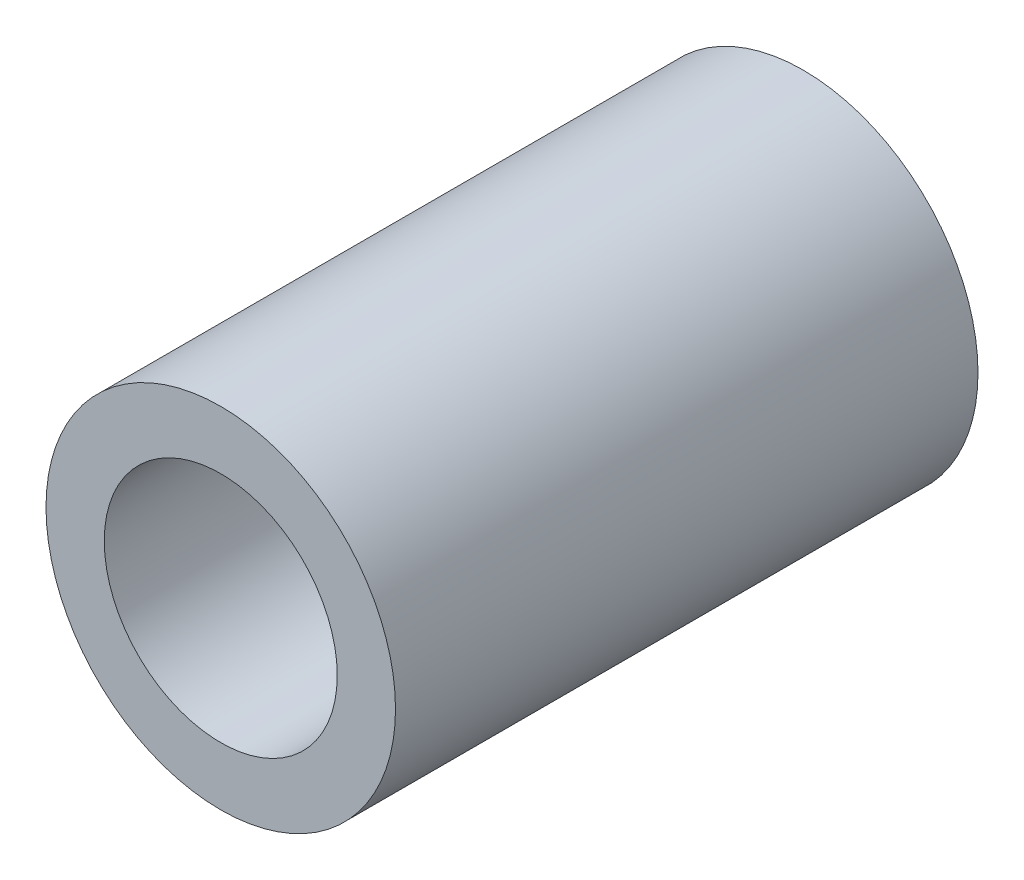
ISO-10303-21;
HEADER;
FILE_DESCRIPTION(('STEP AP214'),'2;1');
FILE_NAME('part.step','',(''),(''),'','','');
FILE_SCHEMA(('AUTOMOTIVE_DESIGN { 1 0 10303 214 1 1 1 1 }'));
ENDSEC;
DATA;
#1=APPLICATION_CONTEXT('core data for automotive mechanical design processes');
#2=APPLICATION_PROTOCOL_DEFINITION('international standard','automotive_design',2000,#1);
#3=PRODUCT_CONTEXT('',#1,'mechanical');
#4=PRODUCT('Part','Part','',(#3));
#5=PRODUCT_RELATED_PRODUCT_CATEGORY('part','',(#4));
#6=PRODUCT_DEFINITION_FORMATION('','',#4);
#7=PRODUCT_DEFINITION_CONTEXT('part definition',#1,'design');
#8=PRODUCT_DEFINITION('design','',#6,#7);
#9=PRODUCT_DEFINITION_SHAPE('','',#8);
#10=(LENGTH_UNIT() NAMED_UNIT(*) SI_UNIT(.MILLI.,.METRE.));
#11=(NAMED_UNIT(*) PLANE_ANGLE_UNIT() SI_UNIT($,.RADIAN.));
#12=(NAMED_UNIT(*) SI_UNIT($,.STERADIAN.) SOLID_ANGLE_UNIT());
#13=UNCERTAINTY_MEASURE_WITH_UNIT(LENGTH_MEASURE(1.E-05),#10,'distance_accuracy_value','');
#14=(GEOMETRIC_REPRESENTATION_CONTEXT(3) GLOBAL_UNCERTAINTY_ASSIGNED_CONTEXT((#13)) GLOBAL_UNIT_ASSIGNED_CONTEXT((#10,
#11,#12)) REPRESENTATION_CONTEXT('',''));
#15=CARTESIAN_POINT('',(0.,0.,0.));
#16=DIRECTION('',(0.,0.,1.));
#17=DIRECTION('',(1.,0.,0.));
#18=AXIS2_PLACEMENT_3D('',#15,#16,#17);
#19=CARTESIAN_POINT('',(0.,0.,100.));
#20=DIRECTION('',(0.,0.,1.));
#21=DIRECTION('',(1.,0.,0.));
#22=AXIS2_PLACEMENT_3D('',#19,#20,#21);
#23=PLANE('',#22);
#24=CARTESIAN_POINT('',(0.,0.,100.));
#25=DIRECTION('',(0.,0.,1.));
#26=DIRECTION('',(1.,0.,0.));
#27=AXIS2_PLACEMENT_3D('',#24,#25,#26);
#28=CIRCLE('',#27,30.);
#29=CARTESIAN_POINT('',(-30.,0.,100.));
#30=VERTEX_POINT('',#29);
#31=EDGE_CURVE('E10',#30,#30,#28,.T.);
#32=ORIENTED_EDGE('',*,*,#31,.T.);
#33=EDGE_LOOP('',(#32));
#34=FACE_BOUND('',#33,.T.);
#35=CARTESIAN_POINT('',(0.,0.,100.));
#36=DIRECTION('',(0.,0.,1.));
#37=DIRECTION('',(1.,0.,0.));
#38=AXIS2_PLACEMENT_3D('',#35,#36,#37);
#39=CIRCLE('',#38,20.);
#40=CARTESIAN_POINT('',(-20.,0.,100.));
#41=VERTEX_POINT('',#40);
#42=EDGE_CURVE('E43',#41,#41,#39,.T.);
#43=ORIENTED_EDGE('',*,*,#42,.F.);
#44=EDGE_LOOP('',(#43));
#45=FACE_BOUND('',#44,.T.);
#46=ADVANCED_FACE('F32',(#34,#45),#23,.T.);
#47=CARTESIAN_POINT('',(0.,0.,0.));
#48=DIRECTION('',(0.,0.,1.));
#49=DIRECTION('',(1.,0.,0.));
#50=AXIS2_PLACEMENT_3D('',#47,#48,#49);
#51=PLANE('',#50);
#52=CARTESIAN_POINT('',(0.,0.,0.));
#53=DIRECTION('',(0.,0.,1.));
#54=DIRECTION('',(1.,0.,0.));
#55=AXIS2_PLACEMENT_3D('',#52,#53,#54);
#56=CIRCLE('',#55,30.);
#57=CARTESIAN_POINT('',(-30.,0.,0.));
#58=VERTEX_POINT('',#57);
#59=EDGE_CURVE('E36',#58,#58,#56,.T.);
#60=ORIENTED_EDGE('',*,*,#59,.F.);
#61=EDGE_LOOP('',(#60));
#62=FACE_BOUND('',#61,.T.);
#63=CARTESIAN_POINT('',(0.,0.,0.));
#64=DIRECTION('',(0.,0.,1.));
#65=DIRECTION('',(1.,0.,0.));
#66=AXIS2_PLACEMENT_3D('',#63,#64,#65);
#67=CIRCLE('',#66,20.);
#68=CARTESIAN_POINT('',(-20.,0.,0.));
#69=VERTEX_POINT('',#68);
#70=EDGE_CURVE('E45',#69,#69,#67,.T.);
#71=ORIENTED_EDGE('',*,*,#70,.T.);
#72=EDGE_LOOP('',(#71));
#73=FACE_BOUND('',#72,.T.);
#74=ADVANCED_FACE('F55',(#62,#73),#51,.F.);
#75=CARTESIAN_POINT('',(0.,0.,100.));
#76=DIRECTION('',(0.,0.,-1.));
#77=DIRECTION('',(-1.,0.,0.));
#78=AXIS2_PLACEMENT_3D('',#75,#76,#77);
#79=CYLINDRICAL_SURFACE('',#78,30.);
#80=CARTESIAN_POINT('',(-30.,0.,100.));
#81=CARTESIAN_POINT('',(-30.,0.,98.9583333333333));
#82=CARTESIAN_POINT('',(-30.,0.,97.9166666666667));
#83=CARTESIAN_POINT('',(-30.,0.,95.8333333333333));
#84=CARTESIAN_POINT('',(-30.,0.,94.7916666666666));
#85=CARTESIAN_POINT('',(-30.,0.,92.7083333333333));
#86=CARTESIAN_POINT('',(-30.,0.,91.6666666666666));
#87=CARTESIAN_POINT('',(-30.,0.,89.5833333333333));
#88=CARTESIAN_POINT('',(-30.,0.,88.5416666666667));
#89=CARTESIAN_POINT('',(-30.,0.,86.4583333333333));
#90=CARTESIAN_POINT('',(-30.,0.,85.4166666666667));
#91=CARTESIAN_POINT('',(-30.,0.,83.3333333333333));
#92=CARTESIAN_POINT('',(-30.,0.,82.2916666666667));
#93=CARTESIAN_POINT('',(-30.,0.,80.2083333333333));
#94=CARTESIAN_POINT('',(-30.,0.,79.1666666666666));
#95=CARTESIAN_POINT('',(-30.,0.,77.0833333333333));
#96=CARTESIAN_POINT('',(-30.,0.,76.0416666666666));
#97=CARTESIAN_POINT('',(-30.,0.,73.9583333333333));
#98=CARTESIAN_POINT('',(-30.,0.,72.9166666666667));
#99=CARTESIAN_POINT('',(-30.,0.,70.8333333333333));
#100=CARTESIAN_POINT('',(-30.,0.,69.7916666666667));
#101=CARTESIAN_POINT('',(-30.,0.,67.7083333333333));
#102=CARTESIAN_POINT('',(-30.,0.,66.6666666666667));
#103=CARTESIAN_POINT('',(-30.,0.,64.5833333333333));
#104=CARTESIAN_POINT('',(-30.,0.,63.5416666666667));
#105=CARTESIAN_POINT('',(-30.,0.,61.4583333333333));
#106=CARTESIAN_POINT('',(-30.,0.,60.4166666666667));
#107=CARTESIAN_POINT('',(-30.,0.,58.3333333333333));
#108=CARTESIAN_POINT('',(-30.,0.,57.2916666666667));
#109=CARTESIAN_POINT('',(-30.,0.,55.2083333333333));
#110=CARTESIAN_POINT('',(-30.,0.,54.1666666666667));
#111=CARTESIAN_POINT('',(-30.,0.,52.0833333333333));
#112=CARTESIAN_POINT('',(-30.,0.,51.0416666666667));
#113=CARTESIAN_POINT('',(-30.,0.,48.9583333333333));
#114=CARTESIAN_POINT('',(-30.,0.,47.9166666666667));
#115=CARTESIAN_POINT('',(-30.,0.,45.8333333333333));
#116=CARTESIAN_POINT('',(-30.,0.,44.7916666666667));
#117=CARTESIAN_POINT('',(-30.,0.,42.7083333333333));
#118=CARTESIAN_POINT('',(-30.,0.,41.6666666666667));
#119=CARTESIAN_POINT('',(-30.,0.,39.5833333333333));
#120=CARTESIAN_POINT('',(-30.,0.,38.5416666666667));
#121=CARTESIAN_POINT('',(-30.,0.,36.4583333333333));
#122=CARTESIAN_POINT('',(-30.,0.,35.4166666666667));
#123=CARTESIAN_POINT('',(-30.,0.,33.3333333333333));
#124=CARTESIAN_POINT('',(-30.,0.,32.2916666666667));
#125=CARTESIAN_POINT('',(-30.,0.,30.2083333333333));
#126=CARTESIAN_POINT('',(-30.,0.,29.1666666666667));
#127=CARTESIAN_POINT('',(-30.,0.,27.0833333333333));
#128=CARTESIAN_POINT('',(-30.,0.,26.0416666666667));
#129=CARTESIAN_POINT('',(-30.,0.,23.9583333333333));
#130=CARTESIAN_POINT('',(-30.,0.,22.9166666666667));
#131=CARTESIAN_POINT('',(-30.,0.,20.8333333333333));
#132=CARTESIAN_POINT('',(-30.,0.,19.7916666666667));
#133=CARTESIAN_POINT('',(-30.,0.,17.7083333333333));
#134=CARTESIAN_POINT('',(-30.,0.,16.6666666666667));
#135=CARTESIAN_POINT('',(-30.,0.,14.5833333333333));
#136=CARTESIAN_POINT('',(-30.,0.,13.5416666666667));
#137=CARTESIAN_POINT('',(-30.,0.,11.4583333333333));
#138=CARTESIAN_POINT('',(-30.,0.,10.4166666666667));
#139=CARTESIAN_POINT('',(-30.,0.,8.33333333333333));
#140=CARTESIAN_POINT('',(-30.,0.,7.29166666666667));
#141=CARTESIAN_POINT('',(-30.,0.,5.20833333333334));
#142=CARTESIAN_POINT('',(-30.,0.,4.16666666666667));
#143=CARTESIAN_POINT('',(-30.,0.,2.08333333333334));
#144=CARTESIAN_POINT('',(-30.,0.,1.04166666666667));
#145=CARTESIAN_POINT('',(-30.,0.,0.));
#146=B_SPLINE_CURVE_WITH_KNOTS('',3,(#80,#81,#82,#83,#84,#85,#86,#87,#88,#89,#90,#91,#92,#93,
#94,#95,#96,#97,#98,#99,#100,#101,#102,#103,#104,#105,#106,#107,#108,#109,#110,#111,#112,#113,
#114,#115,#116,#117,#118,#119,#120,#121,#122,#123,#124,#125,#126,#127,#128,#129,#130,#131,#132,
#133,#134,#135,#136,#137,#138,#139,#140,#141,#142,#143,#144,#145),.UNSPECIFIED.,.F.,.F.,(4,2,2,
2,2,2,2,2,2,2,2,2,2,2,2,2,2,2,2,2,2,2,2,2,2,2,2,2,2,2,2,2,4),(0.,3.12499999999999,
6.24999999999999,9.37499999999999,12.5,15.625,18.75,21.875,25.,28.125,31.25,34.375,37.5,40.625,
43.75,46.875,50.,53.125,56.25,59.375,62.5,65.625,68.75,71.875,75.,78.125,81.25,84.375,87.5,
90.625,93.75,96.875,100.),.UNSPECIFIED.);
#147=EDGE_CURVE('BSEAM34',#30,#58,#146,.T.);
#148=ORIENTED_EDGE('',*,*,#31,.F.);
#149=ORIENTED_EDGE('',*,*,#59,.T.);
#150=ORIENTED_EDGE('',*,*,#147,.T.);
#151=ORIENTED_EDGE('',*,*,#147,.F.);
#152=EDGE_LOOP('',(#148,#150,#149,#151));
#153=FACE_BOUND('',#152,.T.);
#154=ADVANCED_FACE('F34',(#153),#79,.T.);
#155=CARTESIAN_POINT('',(0.,0.,100.));
#156=DIRECTION('',(0.,0.,-1.));
#157=DIRECTION('',(-1.,0.,0.));
#158=AXIS2_PLACEMENT_3D('',#155,#156,#157);
#159=CYLINDRICAL_SURFACE('',#158,20.);
#160=CARTESIAN_POINT('',(-20.,0.,100.));
#161=CARTESIAN_POINT('',(-20.,0.,98.9583333333333));
#162=CARTESIAN_POINT('',(-20.,0.,97.9166666666667));
#163=CARTESIAN_POINT('',(-20.,0.,95.8333333333333));
#164=CARTESIAN_POINT('',(-20.,0.,94.7916666666666));
#165=CARTESIAN_POINT('',(-20.,0.,92.7083333333333));
#166=CARTESIAN_POINT('',(-20.,0.,91.6666666666666));
#167=CARTESIAN_POINT('',(-20.,0.,89.5833333333333));
#168=CARTESIAN_POINT('',(-20.,0.,88.5416666666666));
#169=CARTESIAN_POINT('',(-20.,0.,86.4583333333333));
#170=CARTESIAN_POINT('',(-20.,0.,85.4166666666667));
#171=CARTESIAN_POINT('',(-20.,0.,83.3333333333333));
#172=CARTESIAN_POINT('',(-20.,0.,82.2916666666667));
#173=CARTESIAN_POINT('',(-20.,0.,80.2083333333333));
#174=CARTESIAN_POINT('',(-20.,0.,79.1666666666666));
#175=CARTESIAN_POINT('',(-20.,0.,77.0833333333333));
#176=CARTESIAN_POINT('',(-20.,0.,76.0416666666666));
#177=CARTESIAN_POINT('',(-20.,0.,73.9583333333333));
#178=CARTESIAN_POINT('',(-20.,0.,72.9166666666667));
#179=CARTESIAN_POINT('',(-20.,0.,70.8333333333333));
#180=CARTESIAN_POINT('',(-20.,0.,69.7916666666667));
#181=CARTESIAN_POINT('',(-20.,0.,67.7083333333333));
#182=CARTESIAN_POINT('',(-20.,0.,66.6666666666667));
#183=CARTESIAN_POINT('',(-20.,0.,64.5833333333333));
#184=CARTESIAN_POINT('',(-20.,0.,63.5416666666667));
#185=CARTESIAN_POINT('',(-20.,0.,61.4583333333333));
#186=CARTESIAN_POINT('',(-20.,0.,60.4166666666667));
#187=CARTESIAN_POINT('',(-20.,0.,58.3333333333333));
#188=CARTESIAN_POINT('',(-20.,0.,57.2916666666667));
#189=CARTESIAN_POINT('',(-20.,0.,55.2083333333333));
#190=CARTESIAN_POINT('',(-20.,0.,54.1666666666667));
#191=CARTESIAN_POINT('',(-20.,0.,52.0833333333333));
#192=CARTESIAN_POINT('',(-20.,0.,51.0416666666667));
#193=CARTESIAN_POINT('',(-20.,0.,48.9583333333333));
#194=CARTESIAN_POINT('',(-20.,0.,47.9166666666667));
#195=CARTESIAN_POINT('',(-20.,0.,45.8333333333333));
#196=CARTESIAN_POINT('',(-20.,0.,44.7916666666667));
#197=CARTESIAN_POINT('',(-20.,0.,42.7083333333333));
#198=CARTESIAN_POINT('',(-20.,0.,41.6666666666667));
#199=CARTESIAN_POINT('',(-20.,0.,39.5833333333333));
#200=CARTESIAN_POINT('',(-20.,0.,38.5416666666667));
#201=CARTESIAN_POINT('',(-20.,0.,36.4583333333333));
#202=CARTESIAN_POINT('',(-20.,0.,35.4166666666667));
#203=CARTESIAN_POINT('',(-20.,0.,33.3333333333333));
#204=CARTESIAN_POINT('',(-20.,0.,32.2916666666667));
#205=CARTESIAN_POINT('',(-20.,0.,30.2083333333333));
#206=CARTESIAN_POINT('',(-20.,0.,29.1666666666667));
#207=CARTESIAN_POINT('',(-20.,0.,27.0833333333333));
#208=CARTESIAN_POINT('',(-20.,0.,26.0416666666667));
#209=CARTESIAN_POINT('',(-20.,0.,23.9583333333333));
#210=CARTESIAN_POINT('',(-20.,0.,22.9166666666667));
#211=CARTESIAN_POINT('',(-20.,0.,20.8333333333333));
#212=CARTESIAN_POINT('',(-20.,0.,19.7916666666667));
#213=CARTESIAN_POINT('',(-20.,0.,17.7083333333333));
#214=CARTESIAN_POINT('',(-20.,0.,16.6666666666667));
#215=CARTESIAN_POINT('',(-20.,0.,14.5833333333333));
#216=CARTESIAN_POINT('',(-20.,0.,13.5416666666667));
#217=CARTESIAN_POINT('',(-20.,0.,11.4583333333333));
#218=CARTESIAN_POINT('',(-20.,0.,10.4166666666667));
#219=CARTESIAN_POINT('',(-20.,0.,8.33333333333333));
#220=CARTESIAN_POINT('',(-20.,0.,7.29166666666667));
#221=CARTESIAN_POINT('',(-20.,0.,5.20833333333334));
#222=CARTESIAN_POINT('',(-20.,0.,4.16666666666667));
#223=CARTESIAN_POINT('',(-20.,0.,2.08333333333334));
#224=CARTESIAN_POINT('',(-20.,0.,1.04166666666667));
#225=CARTESIAN_POINT('',(-20.,0.,0.));
#226=B_SPLINE_CURVE_WITH_KNOTS('',3,(#160,#161,#162,#163,#164,#165,#166,#167,#168,#169,#170,
#171,#172,#173,#174,#175,#176,#177,#178,#179,#180,#181,#182,#183,#184,#185,#186,#187,#188,#189,
#190,#191,#192,#193,#194,#195,#196,#197,#198,#199,#200,#201,#202,#203,#204,#205,#206,#207,#208,
#209,#210,#211,#212,#213,#214,#215,#216,#217,#218,#219,#220,#221,#222,#223,#224,#225),
.UNSPECIFIED.,.F.,.F.,(4,2,2,2,2,2,2,2,2,2,2,2,2,2,2,2,2,2,2,2,2,2,2,2,2,2,2,2,2,2,2,2,4),(0.,
3.125,6.25000000000001,9.37500000000001,12.5,15.625,18.75,21.875,25.,28.125,31.25,34.375,37.5,
40.625,43.75,46.875,50.,53.125,56.25,59.375,62.5,65.625,68.75,71.875,75.,78.125,81.25,84.375,
87.5,90.625,93.75,96.875,100.),.UNSPECIFIED.);
#227=EDGE_CURVE('BSEAM51',#41,#69,#226,.T.);
#228=ORIENTED_EDGE('',*,*,#42,.T.);
#229=ORIENTED_EDGE('',*,*,#70,.F.);
#230=ORIENTED_EDGE('',*,*,#227,.T.);
#231=ORIENTED_EDGE('',*,*,#227,.F.);
#232=EDGE_LOOP('',(#228,#230,#229,#231));
#233=FACE_BOUND('',#232,.T.);
#234=ADVANCED_FACE('F51',(#233),#159,.F.);
#235=CLOSED_SHELL('',(#46,#74,#154,#234));
#236=MANIFOLD_SOLID_BREP('B2',#235);
#237=ADVANCED_BREP_SHAPE_REPRESENTATION('',(#18,#236),#14);
#238=SHAPE_DEFINITION_REPRESENTATION(#9,#237);
ENDSEC;
END-ISO-10303-21;
